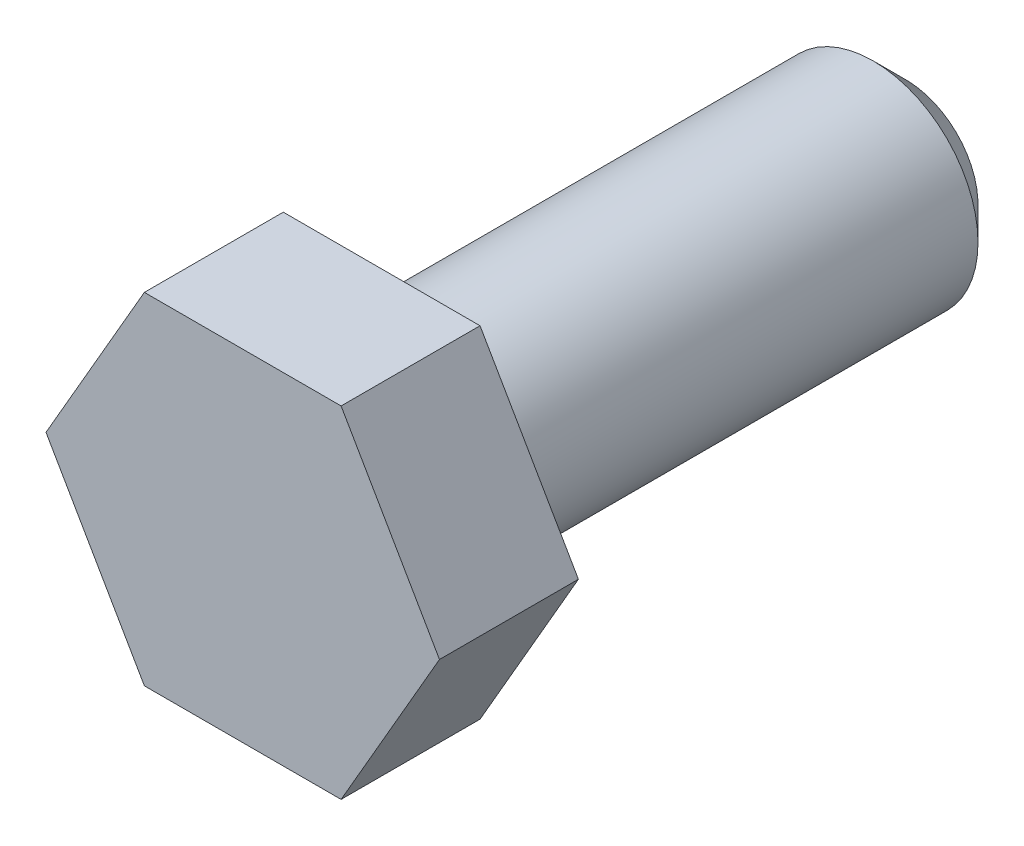
ISO-10303-21;
HEADER;
FILE_DESCRIPTION(('STEP AP214'),'2;1');
FILE_NAME('part.step','',(''),(''),'','','');
FILE_SCHEMA(('AUTOMOTIVE_DESIGN { 1 0 10303 214 1 1 1 1 }'));
ENDSEC;
DATA;
#1=APPLICATION_CONTEXT('core data for automotive mechanical design processes');
#2=APPLICATION_PROTOCOL_DEFINITION('international standard','automotive_design',2000,#1);
#3=PRODUCT_CONTEXT('',#1,'mechanical');
#4=PRODUCT('Part','Part','',(#3));
#5=PRODUCT_RELATED_PRODUCT_CATEGORY('part','',(#4));
#6=PRODUCT_DEFINITION_FORMATION('','',#4);
#7=PRODUCT_DEFINITION_CONTEXT('part definition',#1,'design');
#8=PRODUCT_DEFINITION('design','',#6,#7);
#9=PRODUCT_DEFINITION_SHAPE('','',#8);
#10=(LENGTH_UNIT() NAMED_UNIT(*) SI_UNIT(.MILLI.,.METRE.));
#11=(NAMED_UNIT(*) PLANE_ANGLE_UNIT() SI_UNIT($,.RADIAN.));
#12=(NAMED_UNIT(*) SI_UNIT($,.STERADIAN.) SOLID_ANGLE_UNIT());
#13=UNCERTAINTY_MEASURE_WITH_UNIT(LENGTH_MEASURE(1.E-05),#10,'distance_accuracy_value','');
#14=(GEOMETRIC_REPRESENTATION_CONTEXT(3) GLOBAL_UNCERTAINTY_ASSIGNED_CONTEXT((#13)) GLOBAL_UNIT_ASSIGNED_CONTEXT((#10,
#11,#12)) REPRESENTATION_CONTEXT('',''));
#15=CARTESIAN_POINT('',(0.,0.,0.));
#16=DIRECTION('',(0.,0.,1.));
#17=DIRECTION('',(1.,0.,0.));
#18=AXIS2_PLACEMENT_3D('',#15,#16,#17);
#19=CARTESIAN_POINT('',(-11.2583302491977,-6.5,0.));
#20=DIRECTION('',(0.,0.,1.));
#21=DIRECTION('',(1.,0.,0.));
#22=AXIS2_PLACEMENT_3D('',#19,#20,#21);
#23=PLANE('',#22);
#24=DIRECTION('',(-0.499999999999999,-0.866025403784439,0.));
#25=VECTOR('',#24,1.);
#26=CARTESIAN_POINT('',(-3.75277674973257,6.5,0.));
#27=LINE('',#26,#25);
#28=CARTESIAN_POINT('',(-3.75277674973257,6.5,0.));
#29=VERTEX_POINT('',#28);
#30=CARTESIAN_POINT('',(-7.50555349946513,0.,0.));
#31=VERTEX_POINT('',#30);
#32=EDGE_CURVE('E117',#29,#31,#27,.T.);
#33=ORIENTED_EDGE('',*,*,#32,.F.);
#34=DIRECTION('',(1.,0.,0.));
#35=VECTOR('',#34,1.);
#36=CARTESIAN_POINT('',(-3.75277674973257,6.5,0.));
#37=LINE('',#36,#35);
#38=CARTESIAN_POINT('',(3.75277674973256,6.5,0.));
#39=VERTEX_POINT('',#38);
#40=EDGE_CURVE('E127',#29,#39,#37,.T.);
#41=ORIENTED_EDGE('',*,*,#40,.T.);
#42=DIRECTION('',(0.5,-0.866025403784438,0.));
#43=VECTOR('',#42,1.);
#44=CARTESIAN_POINT('',(3.75277674973256,6.5,0.));
#45=LINE('',#44,#43);
#46=CARTESIAN_POINT('',(7.50555349946513,0.,0.));
#47=VERTEX_POINT('',#46);
#48=EDGE_CURVE('E125',#39,#47,#45,.T.);
#49=ORIENTED_EDGE('',*,*,#48,.T.);
#50=DIRECTION('',(-0.5,-0.866025403784439,0.));
#51=VECTOR('',#50,1.);
#52=CARTESIAN_POINT('',(7.50555349946513,0.,0.));
#53=LINE('',#52,#51);
#54=CARTESIAN_POINT('',(3.75277674973257,-6.5,0.));
#55=VERTEX_POINT('',#54);
#56=EDGE_CURVE('E96',#47,#55,#53,.T.);
#57=ORIENTED_EDGE('',*,*,#56,.T.);
#58=DIRECTION('',(1.,0.,0.));
#59=VECTOR('',#58,1.);
#60=CARTESIAN_POINT('',(-3.75277674973257,-6.5,0.));
#61=LINE('',#60,#59);
#62=CARTESIAN_POINT('',(-3.75277674973257,-6.5,0.));
#63=VERTEX_POINT('',#62);
#64=EDGE_CURVE('E121',#63,#55,#61,.T.);
#65=ORIENTED_EDGE('',*,*,#64,.F.);
#66=DIRECTION('',(0.5,-0.866025403784439,0.));
#67=VECTOR('',#66,1.);
#68=CARTESIAN_POINT('',(-7.50555349946513,0.,0.));
#69=LINE('',#68,#67);
#70=EDGE_CURVE('E119',#31,#63,#69,.T.);
#71=ORIENTED_EDGE('',*,*,#70,.F.);
#72=EDGE_LOOP('',(#33,#41,#49,#57,#65,#71));
#73=FACE_BOUND('',#72,.T.);
#74=CARTESIAN_POINT('',(0.,0.,0.));
#75=DIRECTION('',(0.,0.,1.));
#76=DIRECTION('',(1.,0.,0.));
#77=AXIS2_PLACEMENT_3D('',#74,#75,#76);
#78=CIRCLE('',#77,4.);
#79=CARTESIAN_POINT('',(4.,0.,0.));
#80=VERTEX_POINT('',#79);
#81=EDGE_CURVE('E139',#80,#80,#78,.F.);
#82=ORIENTED_EDGE('',*,*,#81,.F.);
#83=EDGE_LOOP('',(#82));
#84=FACE_BOUND('',#83,.T.);
#85=ADVANCED_FACE('F31',(#73,#84),#23,.F.);
#86=CARTESIAN_POINT('',(-3.75277674973257,6.5,5.3));
#87=DIRECTION('',(0.866025403784439,-0.499999999999999,0.));
#88=DIRECTION('',(0.499999999999999,0.866025403784439,0.));
#89=AXIS2_PLACEMENT_3D('',#86,#87,#88);
#90=PLANE('',#89);
#91=ORIENTED_EDGE('',*,*,#32,.T.);
#92=DIRECTION('',(0.,0.,-1.));
#93=VECTOR('',#92,1.);
#94=CARTESIAN_POINT('',(-7.50555349946513,0.,5.3));
#95=LINE('',#94,#93);
#96=CARTESIAN_POINT('',(-7.50555349946513,0.,5.3));
#97=VERTEX_POINT('',#96);
#98=EDGE_CURVE('E137',#97,#31,#95,.T.);
#99=ORIENTED_EDGE('',*,*,#98,.F.);
#100=DIRECTION('',(-0.499999999999999,-0.866025403784439,0.));
#101=VECTOR('',#100,1.);
#102=CARTESIAN_POINT('',(-3.75277674973257,6.5,5.3));
#103=LINE('',#102,#101);
#104=CARTESIAN_POINT('',(-3.75277674973257,6.5,5.3));
#105=VERTEX_POINT('',#104);
#106=EDGE_CURVE('E130',#105,#97,#103,.T.);
#107=ORIENTED_EDGE('',*,*,#106,.F.);
#108=DIRECTION('',(0.,0.,-1.));
#109=VECTOR('',#108,1.);
#110=CARTESIAN_POINT('',(-3.75277674973257,6.5,5.3));
#111=LINE('',#110,#109);
#112=EDGE_CURVE('E48',#105,#29,#111,.T.);
#113=ORIENTED_EDGE('',*,*,#112,.T.);
#114=EDGE_LOOP('',(#91,#99,#107,#113));
#115=FACE_BOUND('',#114,.T.);
#116=ADVANCED_FACE('F155',(#115),#90,.F.);
#117=CARTESIAN_POINT('',(-7.50555349946513,0.,5.3));
#118=DIRECTION('',(0.866025403784439,0.5,0.));
#119=DIRECTION('',(-0.5,0.866025403784439,0.));
#120=AXIS2_PLACEMENT_3D('',#117,#118,#119);
#121=PLANE('',#120);
#122=ORIENTED_EDGE('',*,*,#70,.T.);
#123=DIRECTION('',(0.,0.,-1.));
#124=VECTOR('',#123,1.);
#125=CARTESIAN_POINT('',(-3.75277674973257,-6.5,5.3));
#126=LINE('',#125,#124);
#127=CARTESIAN_POINT('',(-3.75277674973257,-6.5,5.3));
#128=VERTEX_POINT('',#127);
#129=EDGE_CURVE('E134',#128,#63,#126,.T.);
#130=ORIENTED_EDGE('',*,*,#129,.F.);
#131=DIRECTION('',(0.5,-0.866025403784439,0.));
#132=VECTOR('',#131,1.);
#133=CARTESIAN_POINT('',(-7.50555349946513,0.,5.3));
#134=LINE('',#133,#132);
#135=EDGE_CURVE('E81',#97,#128,#134,.T.);
#136=ORIENTED_EDGE('',*,*,#135,.F.);
#137=ORIENTED_EDGE('',*,*,#98,.T.);
#138=EDGE_LOOP('',(#122,#130,#136,#137));
#139=FACE_BOUND('',#138,.T.);
#140=ADVANCED_FACE('F161',(#139),#121,.F.);
#141=CARTESIAN_POINT('',(-3.75277674973257,-6.5,5.3));
#142=DIRECTION('',(0.,1.,0.));
#143=DIRECTION('',(0.,0.,1.));
#144=AXIS2_PLACEMENT_3D('',#141,#142,#143);
#145=PLANE('',#144);
#146=ORIENTED_EDGE('',*,*,#64,.T.);
#147=DIRECTION('',(0.,0.,-1.));
#148=VECTOR('',#147,1.);
#149=CARTESIAN_POINT('',(3.75277674973257,-6.5,5.3));
#150=LINE('',#149,#148);
#151=CARTESIAN_POINT('',(3.75277674973257,-6.5,5.3));
#152=VERTEX_POINT('',#151);
#153=EDGE_CURVE('E100',#152,#55,#150,.T.);
#154=ORIENTED_EDGE('',*,*,#153,.F.);
#155=DIRECTION('',(1.,0.,0.));
#156=VECTOR('',#155,1.);
#157=CARTESIAN_POINT('',(-3.75277674973257,-6.5,5.3));
#158=LINE('',#157,#156);
#159=EDGE_CURVE('E108',#128,#152,#158,.T.);
#160=ORIENTED_EDGE('',*,*,#159,.F.);
#161=ORIENTED_EDGE('',*,*,#129,.T.);
#162=EDGE_LOOP('',(#146,#154,#160,#161));
#163=FACE_BOUND('',#162,.T.);
#164=ADVANCED_FACE('F173',(#163),#145,.F.);
#165=CARTESIAN_POINT('',(7.50555349946513,0.,5.3));
#166=DIRECTION('',(0.866025403784439,-0.5,0.));
#167=DIRECTION('',(0.5,0.866025403784439,0.));
#168=AXIS2_PLACEMENT_3D('',#165,#166,#167);
#169=PLANE('',#168);
#170=ORIENTED_EDGE('',*,*,#56,.F.);
#171=DIRECTION('',(0.,0.,-1.));
#172=VECTOR('',#171,1.);
#173=CARTESIAN_POINT('',(7.50555349946513,0.,5.3));
#174=LINE('',#173,#172);
#175=CARTESIAN_POINT('',(7.50555349946513,0.,5.3));
#176=VERTEX_POINT('',#175);
#177=EDGE_CURVE('E91',#176,#47,#174,.T.);
#178=ORIENTED_EDGE('',*,*,#177,.F.);
#179=DIRECTION('',(-0.5,-0.866025403784439,0.));
#180=VECTOR('',#179,1.);
#181=CARTESIAN_POINT('',(7.50555349946513,0.,5.3));
#182=LINE('',#181,#180);
#183=EDGE_CURVE('E94',#176,#152,#182,.T.);
#184=ORIENTED_EDGE('',*,*,#183,.T.);
#185=ORIENTED_EDGE('',*,*,#153,.T.);
#186=EDGE_LOOP('',(#170,#178,#184,#185));
#187=FACE_BOUND('',#186,.T.);
#188=ADVANCED_FACE('F93',(#187),#169,.T.);
#189=CARTESIAN_POINT('',(3.75277674973256,6.5,5.3));
#190=DIRECTION('',(0.866025403784438,0.5,0.));
#191=DIRECTION('',(-0.5,0.866025403784438,0.));
#192=AXIS2_PLACEMENT_3D('',#189,#190,#191);
#193=PLANE('',#192);
#194=ORIENTED_EDGE('',*,*,#48,.F.);
#195=DIRECTION('',(0.,0.,-1.));
#196=VECTOR('',#195,1.);
#197=CARTESIAN_POINT('',(3.75277674973256,6.5,5.3));
#198=LINE('',#197,#196);
#199=CARTESIAN_POINT('',(3.75277674973256,6.5,5.3));
#200=VERTEX_POINT('',#199);
#201=EDGE_CURVE('E68',#200,#39,#198,.T.);
#202=ORIENTED_EDGE('',*,*,#201,.F.);
#203=DIRECTION('',(0.5,-0.866025403784438,0.));
#204=VECTOR('',#203,1.);
#205=CARTESIAN_POINT('',(3.75277674973256,6.5,5.3));
#206=LINE('',#205,#204);
#207=EDGE_CURVE('E106',#200,#176,#206,.T.);
#208=ORIENTED_EDGE('',*,*,#207,.T.);
#209=ORIENTED_EDGE('',*,*,#177,.T.);
#210=EDGE_LOOP('',(#194,#202,#208,#209));
#211=FACE_BOUND('',#210,.T.);
#212=ADVANCED_FACE('F111',(#211),#193,.T.);
#213=CARTESIAN_POINT('',(-3.75277674973257,6.5,5.3));
#214=DIRECTION('',(0.,1.,0.));
#215=DIRECTION('',(0.,0.,1.));
#216=AXIS2_PLACEMENT_3D('',#213,#214,#215);
#217=PLANE('',#216);
#218=ORIENTED_EDGE('',*,*,#40,.F.);
#219=ORIENTED_EDGE('',*,*,#112,.F.);
#220=DIRECTION('',(1.,0.,0.));
#221=VECTOR('',#220,1.);
#222=CARTESIAN_POINT('',(-3.75277674973257,6.5,5.3));
#223=LINE('',#222,#221);
#224=EDGE_CURVE('E112',#105,#200,#223,.T.);
#225=ORIENTED_EDGE('',*,*,#224,.T.);
#226=ORIENTED_EDGE('',*,*,#201,.T.);
#227=EDGE_LOOP('',(#218,#219,#225,#226));
#228=FACE_BOUND('',#227,.T.);
#229=ADVANCED_FACE('F166',(#228),#217,.T.);
#230=CARTESIAN_POINT('',(-11.2583302491977,-6.5,5.3));
#231=DIRECTION('',(0.,0.,1.));
#232=DIRECTION('',(1.,0.,0.));
#233=AXIS2_PLACEMENT_3D('',#230,#231,#232);
#234=PLANE('',#233);
#235=ORIENTED_EDGE('',*,*,#106,.T.);
#236=ORIENTED_EDGE('',*,*,#135,.T.);
#237=ORIENTED_EDGE('',*,*,#159,.T.);
#238=ORIENTED_EDGE('',*,*,#183,.F.);
#239=ORIENTED_EDGE('',*,*,#207,.F.);
#240=ORIENTED_EDGE('',*,*,#224,.F.);
#241=EDGE_LOOP('',(#235,#236,#237,#238,#239,#240));
#242=FACE_BOUND('',#241,.T.);
#243=ADVANCED_FACE('F104',(#242),#234,.T.);
#244=CARTESIAN_POINT('',(0.,0.,-20.));
#245=DIRECTION('',(0.,0.,1.));
#246=DIRECTION('',(1.,0.,0.));
#247=AXIS2_PLACEMENT_3D('',#244,#245,#246);
#248=CYLINDRICAL_SURFACE('',#247,4.);
#249=CARTESIAN_POINT('',(0.,0.,-18.75));
#250=DIRECTION('',(0.,0.,-1.));
#251=DIRECTION('',(-1.,0.,0.));
#252=AXIS2_PLACEMENT_3D('',#249,#250,#251);
#253=CIRCLE('',#252,4.);
#254=CARTESIAN_POINT('',(-4.,0.,-18.75));
#255=VERTEX_POINT('',#254);
#256=EDGE_CURVE('E11',#255,#255,#253,.F.);
#257=ORIENTED_EDGE('',*,*,#256,.T.);
#258=EDGE_LOOP('',(#257));
#259=FACE_BOUND('',#258,.T.);
#260=ORIENTED_EDGE('',*,*,#81,.T.);
#261=EDGE_LOOP('',(#260));
#262=FACE_BOUND('',#261,.T.);
#263=ADVANCED_FACE('F151',(#259,#262),#248,.T.);
#264=CARTESIAN_POINT('',(0.,0.,-20.));
#265=DIRECTION('',(0.,0.,-1.));
#266=DIRECTION('',(-1.,0.,0.));
#267=AXIS2_PLACEMENT_3D('',#264,#265,#266);
#268=PLANE('',#267);
#269=CARTESIAN_POINT('',(0.,0.,-20.));
#270=DIRECTION('',(0.,0.,-1.));
#271=DIRECTION('',(-1.,0.,0.));
#272=AXIS2_PLACEMENT_3D('',#269,#270,#271);
#273=CIRCLE('',#272,2.74999999999998);
#274=CARTESIAN_POINT('',(-2.74999999999998,0.,-20.));
#275=VERTEX_POINT('',#274);
#276=EDGE_CURVE('E40',#275,#275,#273,.T.);
#277=ORIENTED_EDGE('',*,*,#276,.T.);
#278=EDGE_LOOP('',(#277));
#279=FACE_BOUND('',#278,.T.);
#280=ADVANCED_FACE('F144',(#279),#268,.T.);
#281=CARTESIAN_POINT('',(0.,0.,-20.));
#282=DIRECTION('',(0.,0.,1.));
#283=DIRECTION('',(1.,0.,0.));
#284=AXIS2_PLACEMENT_3D('',#281,#282,#283);
#285=CONICAL_SURFACE('',#284,2.74999999999998,0.785398163397454);
#286=ORIENTED_EDGE('',*,*,#256,.F.);
#287=EDGE_LOOP('',(#286));
#288=FACE_BOUND('',#287,.T.);
#289=ORIENTED_EDGE('',*,*,#276,.F.);
#290=EDGE_LOOP('',(#289));
#291=FACE_BOUND('',#290,.T.);
#292=ADVANCED_FACE('F33',(#288,#291),#285,.T.);
#293=CLOSED_SHELL('',(#85,#116,#140,#164,#188,#212,#229,#243,#263,#280,#292));
#294=MANIFOLD_SOLID_BREP('B2',#293);
#295=ADVANCED_BREP_SHAPE_REPRESENTATION('',(#18,#294),#14);
#296=SHAPE_DEFINITION_REPRESENTATION(#9,#295);
ENDSEC;
END-ISO-10303-21;
